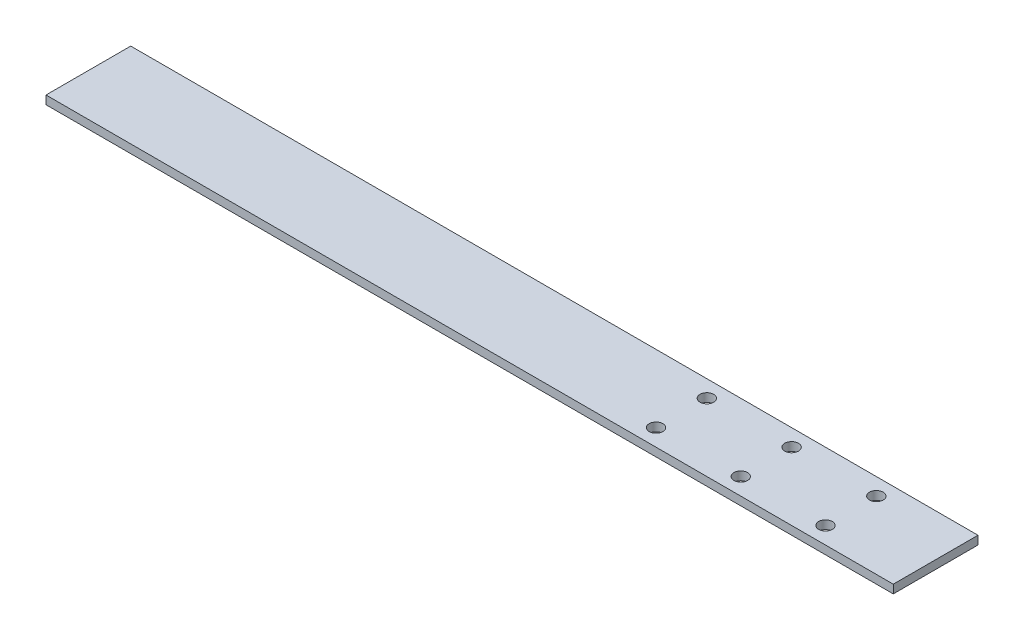
ISO-10303-21;
HEADER;
FILE_DESCRIPTION(('STEP AP214'),'2;1');
FILE_NAME('part.step','',(''),(''),'','','');
FILE_SCHEMA(('AUTOMOTIVE_DESIGN { 1 0 10303 214 1 1 1 1 }'));
ENDSEC;
DATA;
#1=APPLICATION_CONTEXT('core data for automotive mechanical design processes');
#2=APPLICATION_PROTOCOL_DEFINITION('international standard','automotive_design',2000,#1);
#3=PRODUCT_CONTEXT('',#1,'mechanical');
#4=PRODUCT('Part','Part','',(#3));
#5=PRODUCT_RELATED_PRODUCT_CATEGORY('part','',(#4));
#6=PRODUCT_DEFINITION_FORMATION('','',#4);
#7=PRODUCT_DEFINITION_CONTEXT('part definition',#1,'design');
#8=PRODUCT_DEFINITION('design','',#6,#7);
#9=PRODUCT_DEFINITION_SHAPE('','',#8);
#10=(LENGTH_UNIT() NAMED_UNIT(*) SI_UNIT(.MILLI.,.METRE.));
#11=(NAMED_UNIT(*) PLANE_ANGLE_UNIT() SI_UNIT($,.RADIAN.));
#12=(NAMED_UNIT(*) SI_UNIT($,.STERADIAN.) SOLID_ANGLE_UNIT());
#13=UNCERTAINTY_MEASURE_WITH_UNIT(LENGTH_MEASURE(1.E-05),#10,'distance_accuracy_value','');
#14=(GEOMETRIC_REPRESENTATION_CONTEXT(3) GLOBAL_UNCERTAINTY_ASSIGNED_CONTEXT((#13)) GLOBAL_UNIT_ASSIGNED_CONTEXT((#10,
#11,#12)) REPRESENTATION_CONTEXT('',''));
#15=CARTESIAN_POINT('',(0.,0.,0.));
#16=DIRECTION('',(0.,0.,1.));
#17=DIRECTION('',(1.,0.,0.));
#18=AXIS2_PLACEMENT_3D('',#15,#16,#17);
#19=CARTESIAN_POINT('',(0.,5.,0.));
#20=DIRECTION('',(1.,0.,0.));
#21=DIRECTION('',(0.,0.,-1.));
#22=AXIS2_PLACEMENT_3D('',#19,#20,#21);
#23=PLANE('',#22);
#24=DIRECTION('',(0.,0.,1.));
#25=VECTOR('',#24,1.);
#26=CARTESIAN_POINT('',(0.,0.,0.));
#27=LINE('',#26,#25);
#28=CARTESIAN_POINT('',(0.,0.,-50.));
#29=VERTEX_POINT('',#28);
#30=CARTESIAN_POINT('',(0.,0.,0.));
#31=VERTEX_POINT('',#30);
#32=EDGE_CURVE('E101',#29,#31,#27,.T.);
#33=ORIENTED_EDGE('',*,*,#32,.T.);
#34=DIRECTION('',(0.,-1.,0.));
#35=VECTOR('',#34,1.);
#36=CARTESIAN_POINT('',(0.,5.,0.));
#37=LINE('',#36,#35);
#38=CARTESIAN_POINT('',(0.,5.,0.));
#39=VERTEX_POINT('',#38);
#40=EDGE_CURVE('E12',#39,#31,#37,.T.);
#41=ORIENTED_EDGE('',*,*,#40,.F.);
#42=DIRECTION('',(0.,0.,1.));
#43=VECTOR('',#42,1.);
#44=CARTESIAN_POINT('',(0.,5.,0.));
#45=LINE('',#44,#43);
#46=CARTESIAN_POINT('',(0.,5.,-50.));
#47=VERTEX_POINT('',#46);
#48=EDGE_CURVE('E88',#47,#39,#45,.T.);
#49=ORIENTED_EDGE('',*,*,#48,.F.);
#50=DIRECTION('',(0.,-1.,0.));
#51=VECTOR('',#50,1.);
#52=CARTESIAN_POINT('',(0.,5.,-50.));
#53=LINE('',#52,#51);
#54=EDGE_CURVE('E97',#47,#29,#53,.T.);
#55=ORIENTED_EDGE('',*,*,#54,.T.);
#56=EDGE_LOOP('',(#33,#41,#49,#55));
#57=FACE_BOUND('',#56,.T.);
#58=ADVANCED_FACE('F35',(#57),#23,.F.);
#59=CARTESIAN_POINT('',(0.,5.,0.));
#60=DIRECTION('',(0.,0.,-1.));
#61=DIRECTION('',(-1.,0.,0.));
#62=AXIS2_PLACEMENT_3D('',#59,#60,#61);
#63=PLANE('',#62);
#64=DIRECTION('',(1.,0.,0.));
#65=VECTOR('',#64,1.);
#66=CARTESIAN_POINT('',(0.,0.,0.));
#67=LINE('',#66,#65);
#68=CARTESIAN_POINT('',(500.,0.,0.));
#69=VERTEX_POINT('',#68);
#70=EDGE_CURVE('E92',#31,#69,#67,.T.);
#71=ORIENTED_EDGE('',*,*,#70,.T.);
#72=DIRECTION('',(0.,-1.,0.));
#73=VECTOR('',#72,1.);
#74=CARTESIAN_POINT('',(500.,5.,0.));
#75=LINE('',#74,#73);
#76=CARTESIAN_POINT('',(500.,5.,0.));
#77=VERTEX_POINT('',#76);
#78=EDGE_CURVE('E44',#77,#69,#75,.T.);
#79=ORIENTED_EDGE('',*,*,#78,.F.);
#80=DIRECTION('',(1.,0.,0.));
#81=VECTOR('',#80,1.);
#82=CARTESIAN_POINT('',(0.,5.,0.));
#83=LINE('',#82,#81);
#84=EDGE_CURVE('E83',#39,#77,#83,.T.);
#85=ORIENTED_EDGE('',*,*,#84,.F.);
#86=ORIENTED_EDGE('',*,*,#40,.T.);
#87=EDGE_LOOP('',(#71,#79,#85,#86));
#88=FACE_BOUND('',#87,.T.);
#89=ADVANCED_FACE('F91',(#88),#63,.F.);
#90=CARTESIAN_POINT('',(500.,5.,0.));
#91=DIRECTION('',(-1.,0.,0.));
#92=DIRECTION('',(0.,0.,1.));
#93=AXIS2_PLACEMENT_3D('',#90,#91,#92);
#94=PLANE('',#93);
#95=DIRECTION('',(0.,0.,-1.));
#96=VECTOR('',#95,1.);
#97=CARTESIAN_POINT('',(500.,0.,0.));
#98=LINE('',#97,#96);
#99=CARTESIAN_POINT('',(500.,0.,-50.));
#100=VERTEX_POINT('',#99);
#101=EDGE_CURVE('E70',#69,#100,#98,.T.);
#102=ORIENTED_EDGE('',*,*,#101,.T.);
#103=DIRECTION('',(0.,-1.,0.));
#104=VECTOR('',#103,1.);
#105=CARTESIAN_POINT('',(500.,5.,-50.));
#106=LINE('',#105,#104);
#107=CARTESIAN_POINT('',(500.,5.,-50.));
#108=VERTEX_POINT('',#107);
#109=EDGE_CURVE('E93',#108,#100,#106,.T.);
#110=ORIENTED_EDGE('',*,*,#109,.F.);
#111=DIRECTION('',(0.,0.,-1.));
#112=VECTOR('',#111,1.);
#113=CARTESIAN_POINT('',(500.,5.,0.));
#114=LINE('',#113,#112);
#115=EDGE_CURVE('E86',#77,#108,#114,.T.);
#116=ORIENTED_EDGE('',*,*,#115,.F.);
#117=ORIENTED_EDGE('',*,*,#78,.T.);
#118=EDGE_LOOP('',(#102,#110,#116,#117));
#119=FACE_BOUND('',#118,.T.);
#120=ADVANCED_FACE('F95',(#119),#94,.F.);
#121=CARTESIAN_POINT('',(0.,5.,-50.));
#122=DIRECTION('',(0.,0.,1.));
#123=DIRECTION('',(1.,0.,0.));
#124=AXIS2_PLACEMENT_3D('',#121,#122,#123);
#125=PLANE('',#124);
#126=DIRECTION('',(-1.,0.,0.));
#127=VECTOR('',#126,1.);
#128=CARTESIAN_POINT('',(0.,0.,-50.));
#129=LINE('',#128,#127);
#130=EDGE_CURVE('E76',#100,#29,#129,.T.);
#131=ORIENTED_EDGE('',*,*,#130,.T.);
#132=ORIENTED_EDGE('',*,*,#54,.F.);
#133=DIRECTION('',(-1.,0.,0.));
#134=VECTOR('',#133,1.);
#135=CARTESIAN_POINT('',(0.,5.,-50.));
#136=LINE('',#135,#134);
#137=EDGE_CURVE('E53',#108,#47,#136,.T.);
#138=ORIENTED_EDGE('',*,*,#137,.F.);
#139=ORIENTED_EDGE('',*,*,#109,.T.);
#140=EDGE_LOOP('',(#131,#132,#138,#139));
#141=FACE_BOUND('',#140,.T.);
#142=ADVANCED_FACE('F154',(#141),#125,.F.);
#143=CARTESIAN_POINT('',(0.,5.,0.));
#144=DIRECTION('',(0.,-1.,0.));
#145=DIRECTION('',(0.,0.,-1.));
#146=AXIS2_PLACEMENT_3D('',#143,#144,#145);
#147=PLANE('',#146);
#148=CARTESIAN_POINT('',(350.,5.,-9.9999999999993));
#149=DIRECTION('',(0.,1.,0.));
#150=DIRECTION('',(0.,0.,1.));
#151=AXIS2_PLACEMENT_3D('',#148,#149,#150);
#152=CIRCLE('',#151,4.05000000000002);
#153=CARTESIAN_POINT('',(350.,5.,-5.94999999999929));
#154=VERTEX_POINT('',#153);
#155=EDGE_CURVE('E140',#154,#154,#152,.T.);
#156=ORIENTED_EDGE('',*,*,#155,.F.);
#157=EDGE_LOOP('',(#156));
#158=FACE_BOUND('',#157,.T.);
#159=CARTESIAN_POINT('',(350.,5.,-39.9999999999993));
#160=DIRECTION('',(0.,1.,0.));
#161=DIRECTION('',(0.,0.,1.));
#162=AXIS2_PLACEMENT_3D('',#159,#160,#161);
#163=CIRCLE('',#162,4.05000000000002);
#164=CARTESIAN_POINT('',(350.,5.,-35.9499999999993));
#165=VERTEX_POINT('',#164);
#166=EDGE_CURVE('E143',#165,#165,#163,.T.);
#167=ORIENTED_EDGE('',*,*,#166,.F.);
#168=EDGE_LOOP('',(#167));
#169=FACE_BOUND('',#168,.T.);
#170=CARTESIAN_POINT('',(400.,5.,-9.99999999999965));
#171=DIRECTION('',(0.,1.,0.));
#172=DIRECTION('',(0.,0.,1.));
#173=AXIS2_PLACEMENT_3D('',#170,#171,#172);
#174=CIRCLE('',#173,4.05000000000002);
#175=CARTESIAN_POINT('',(400.,5.,-5.94999999999964));
#176=VERTEX_POINT('',#175);
#177=EDGE_CURVE('E137',#176,#176,#174,.T.);
#178=ORIENTED_EDGE('',*,*,#177,.F.);
#179=EDGE_LOOP('',(#178));
#180=FACE_BOUND('',#179,.T.);
#181=CARTESIAN_POINT('',(400.,5.,-39.9999999999997));
#182=DIRECTION('',(0.,1.,0.));
#183=DIRECTION('',(0.,0.,1.));
#184=AXIS2_PLACEMENT_3D('',#181,#182,#183);
#185=CIRCLE('',#184,4.05000000000002);
#186=CARTESIAN_POINT('',(400.,5.,-35.9499999999996));
#187=VERTEX_POINT('',#186);
#188=EDGE_CURVE('E134',#187,#187,#185,.T.);
#189=ORIENTED_EDGE('',*,*,#188,.F.);
#190=EDGE_LOOP('',(#189));
#191=FACE_BOUND('',#190,.T.);
#192=CARTESIAN_POINT('',(450.,5.,-40.));
#193=DIRECTION('',(0.,1.,0.));
#194=DIRECTION('',(0.,0.,1.));
#195=AXIS2_PLACEMENT_3D('',#192,#193,#194);
#196=CIRCLE('',#195,4.05000000000002);
#197=CARTESIAN_POINT('',(450.,5.,-35.95));
#198=VERTEX_POINT('',#197);
#199=EDGE_CURVE('E117',#198,#198,#196,.T.);
#200=ORIENTED_EDGE('',*,*,#199,.F.);
#201=EDGE_LOOP('',(#200));
#202=FACE_BOUND('',#201,.T.);
#203=CARTESIAN_POINT('',(450.,5.,-10.));
#204=DIRECTION('',(0.,1.,0.));
#205=DIRECTION('',(0.,0.,1.));
#206=AXIS2_PLACEMENT_3D('',#203,#204,#205);
#207=CIRCLE('',#206,4.05000000000002);
#208=CARTESIAN_POINT('',(450.,5.,-5.94999999999998));
#209=VERTEX_POINT('',#208);
#210=EDGE_CURVE('E112',#209,#209,#207,.T.);
#211=ORIENTED_EDGE('',*,*,#210,.F.);
#212=EDGE_LOOP('',(#211));
#213=FACE_BOUND('',#212,.T.);
#214=ORIENTED_EDGE('',*,*,#48,.T.);
#215=ORIENTED_EDGE('',*,*,#84,.T.);
#216=ORIENTED_EDGE('',*,*,#115,.T.);
#217=ORIENTED_EDGE('',*,*,#137,.T.);
#218=EDGE_LOOP('',(#214,#215,#216,#217));
#219=FACE_BOUND('',#218,.T.);
#220=ADVANCED_FACE('F84',(#158,#169,#180,#191,#202,#213,#219),#147,.F.);
#221=CARTESIAN_POINT('',(0.,0.,0.));
#222=DIRECTION('',(0.,-1.,0.));
#223=DIRECTION('',(0.,0.,-1.));
#224=AXIS2_PLACEMENT_3D('',#221,#222,#223);
#225=PLANE('',#224);
#226=CARTESIAN_POINT('',(350.,0.,-9.9999999999993));
#227=DIRECTION('',(0.,-1.,0.));
#228=DIRECTION('',(0.,0.,-1.));
#229=AXIS2_PLACEMENT_3D('',#226,#227,#228);
#230=CIRCLE('',#229,4.05000000000002);
#231=CARTESIAN_POINT('',(350.,0.,-14.0499999999993));
#232=VERTEX_POINT('',#231);
#233=EDGE_CURVE('E38',#232,#232,#230,.T.);
#234=ORIENTED_EDGE('',*,*,#233,.F.);
#235=EDGE_LOOP('',(#234));
#236=FACE_BOUND('',#235,.T.);
#237=CARTESIAN_POINT('',(350.,0.,-39.9999999999993));
#238=DIRECTION('',(0.,-1.,0.));
#239=DIRECTION('',(0.,0.,-1.));
#240=AXIS2_PLACEMENT_3D('',#237,#238,#239);
#241=CIRCLE('',#240,4.05000000000002);
#242=CARTESIAN_POINT('',(350.,0.,-44.0499999999993));
#243=VERTEX_POINT('',#242);
#244=EDGE_CURVE('E122',#243,#243,#241,.T.);
#245=ORIENTED_EDGE('',*,*,#244,.F.);
#246=EDGE_LOOP('',(#245));
#247=FACE_BOUND('',#246,.T.);
#248=CARTESIAN_POINT('',(400.,0.,-9.99999999999965));
#249=DIRECTION('',(0.,-1.,0.));
#250=DIRECTION('',(0.,0.,-1.));
#251=AXIS2_PLACEMENT_3D('',#248,#249,#250);
#252=CIRCLE('',#251,4.05000000000002);
#253=CARTESIAN_POINT('',(400.,0.,-14.0499999999997));
#254=VERTEX_POINT('',#253);
#255=EDGE_CURVE('E120',#254,#254,#252,.T.);
#256=ORIENTED_EDGE('',*,*,#255,.F.);
#257=EDGE_LOOP('',(#256));
#258=FACE_BOUND('',#257,.T.);
#259=CARTESIAN_POINT('',(400.,0.,-39.9999999999997));
#260=DIRECTION('',(0.,-1.,0.));
#261=DIRECTION('',(0.,0.,-1.));
#262=AXIS2_PLACEMENT_3D('',#259,#260,#261);
#263=CIRCLE('',#262,4.05000000000002);
#264=CARTESIAN_POINT('',(400.,0.,-44.0499999999997));
#265=VERTEX_POINT('',#264);
#266=EDGE_CURVE('E116',#265,#265,#263,.T.);
#267=ORIENTED_EDGE('',*,*,#266,.F.);
#268=EDGE_LOOP('',(#267));
#269=FACE_BOUND('',#268,.T.);
#270=CARTESIAN_POINT('',(450.,0.,-40.));
#271=DIRECTION('',(0.,-1.,0.));
#272=DIRECTION('',(0.,0.,-1.));
#273=AXIS2_PLACEMENT_3D('',#270,#271,#272);
#274=CIRCLE('',#273,4.05000000000002);
#275=CARTESIAN_POINT('',(450.,0.,-44.05));
#276=VERTEX_POINT('',#275);
#277=EDGE_CURVE('E113',#276,#276,#274,.T.);
#278=ORIENTED_EDGE('',*,*,#277,.F.);
#279=EDGE_LOOP('',(#278));
#280=FACE_BOUND('',#279,.T.);
#281=CARTESIAN_POINT('',(450.,0.,-10.));
#282=DIRECTION('',(0.,-1.,0.));
#283=DIRECTION('',(0.,0.,-1.));
#284=AXIS2_PLACEMENT_3D('',#281,#282,#283);
#285=CIRCLE('',#284,4.05000000000002);
#286=CARTESIAN_POINT('',(450.,0.,-14.05));
#287=VERTEX_POINT('',#286);
#288=EDGE_CURVE('E104',#287,#287,#285,.T.);
#289=ORIENTED_EDGE('',*,*,#288,.F.);
#290=EDGE_LOOP('',(#289));
#291=FACE_BOUND('',#290,.T.);
#292=ORIENTED_EDGE('',*,*,#32,.F.);
#293=ORIENTED_EDGE('',*,*,#130,.F.);
#294=ORIENTED_EDGE('',*,*,#101,.F.);
#295=ORIENTED_EDGE('',*,*,#70,.F.);
#296=EDGE_LOOP('',(#292,#293,#294,#295));
#297=FACE_BOUND('',#296,.T.);
#298=ADVANCED_FACE('F153',(#236,#247,#258,#269,#280,#291,#297),#225,.T.);
#299=CARTESIAN_POINT('',(450.,-27.,-10.));
#300=DIRECTION('',(0.,1.,0.));
#301=DIRECTION('',(0.,0.,1.));
#302=AXIS2_PLACEMENT_3D('',#299,#300,#301);
#303=CYLINDRICAL_SURFACE('',#302,4.05000000000002);
#304=ORIENTED_EDGE('',*,*,#288,.T.);
#305=EDGE_LOOP('',(#304));
#306=FACE_BOUND('',#305,.T.);
#307=ORIENTED_EDGE('',*,*,#210,.T.);
#308=EDGE_LOOP('',(#307));
#309=FACE_BOUND('',#308,.T.);
#310=ADVANCED_FACE('F165',(#306,#309),#303,.F.);
#311=CARTESIAN_POINT('',(450.,-27.,-40.));
#312=DIRECTION('',(0.,1.,0.));
#313=DIRECTION('',(0.,0.,1.));
#314=AXIS2_PLACEMENT_3D('',#311,#312,#313);
#315=CYLINDRICAL_SURFACE('',#314,4.05000000000002);
#316=ORIENTED_EDGE('',*,*,#277,.T.);
#317=EDGE_LOOP('',(#316));
#318=FACE_BOUND('',#317,.T.);
#319=ORIENTED_EDGE('',*,*,#199,.T.);
#320=EDGE_LOOP('',(#319));
#321=FACE_BOUND('',#320,.T.);
#322=ADVANCED_FACE('F162',(#318,#321),#315,.F.);
#323=CARTESIAN_POINT('',(400.,-27.,-39.9999999999997));
#324=DIRECTION('',(0.,1.,0.));
#325=DIRECTION('',(0.,0.,1.));
#326=AXIS2_PLACEMENT_3D('',#323,#324,#325);
#327=CYLINDRICAL_SURFACE('',#326,4.05000000000002);
#328=ORIENTED_EDGE('',*,*,#266,.T.);
#329=EDGE_LOOP('',(#328));
#330=FACE_BOUND('',#329,.T.);
#331=ORIENTED_EDGE('',*,*,#188,.T.);
#332=EDGE_LOOP('',(#331));
#333=FACE_BOUND('',#332,.T.);
#334=ADVANCED_FACE('F164',(#330,#333),#327,.F.);
#335=CARTESIAN_POINT('',(400.,-27.,-9.99999999999965));
#336=DIRECTION('',(0.,1.,0.));
#337=DIRECTION('',(0.,0.,1.));
#338=AXIS2_PLACEMENT_3D('',#335,#336,#337);
#339=CYLINDRICAL_SURFACE('',#338,4.05000000000002);
#340=ORIENTED_EDGE('',*,*,#255,.T.);
#341=EDGE_LOOP('',(#340));
#342=FACE_BOUND('',#341,.T.);
#343=ORIENTED_EDGE('',*,*,#177,.T.);
#344=EDGE_LOOP('',(#343));
#345=FACE_BOUND('',#344,.T.);
#346=ADVANCED_FACE('F149',(#342,#345),#339,.F.);
#347=CARTESIAN_POINT('',(350.,-27.,-39.9999999999993));
#348=DIRECTION('',(0.,1.,0.));
#349=DIRECTION('',(0.,0.,1.));
#350=AXIS2_PLACEMENT_3D('',#347,#348,#349);
#351=CYLINDRICAL_SURFACE('',#350,4.05000000000002);
#352=ORIENTED_EDGE('',*,*,#244,.T.);
#353=EDGE_LOOP('',(#352));
#354=FACE_BOUND('',#353,.T.);
#355=ORIENTED_EDGE('',*,*,#166,.T.);
#356=EDGE_LOOP('',(#355));
#357=FACE_BOUND('',#356,.T.);
#358=ADVANCED_FACE('F235',(#354,#357),#351,.F.);
#359=CARTESIAN_POINT('',(350.,-27.,-9.9999999999993));
#360=DIRECTION('',(0.,1.,0.));
#361=DIRECTION('',(0.,0.,1.));
#362=AXIS2_PLACEMENT_3D('',#359,#360,#361);
#363=CYLINDRICAL_SURFACE('',#362,4.05000000000002);
#364=ORIENTED_EDGE('',*,*,#233,.T.);
#365=EDGE_LOOP('',(#364));
#366=FACE_BOUND('',#365,.T.);
#367=ORIENTED_EDGE('',*,*,#155,.T.);
#368=EDGE_LOOP('',(#367));
#369=FACE_BOUND('',#368,.T.);
#370=ADVANCED_FACE('F245',(#366,#369),#363,.F.);
#371=CLOSED_SHELL('',(#58,#89,#120,#142,#220,#298,#310,#322,#334,#346,#358,#370));
#372=MANIFOLD_SOLID_BREP('B2',#371);
#373=ADVANCED_BREP_SHAPE_REPRESENTATION('',(#18,#372),#14);
#374=SHAPE_DEFINITION_REPRESENTATION(#9,#373);
ENDSEC;
END-ISO-10303-21;
